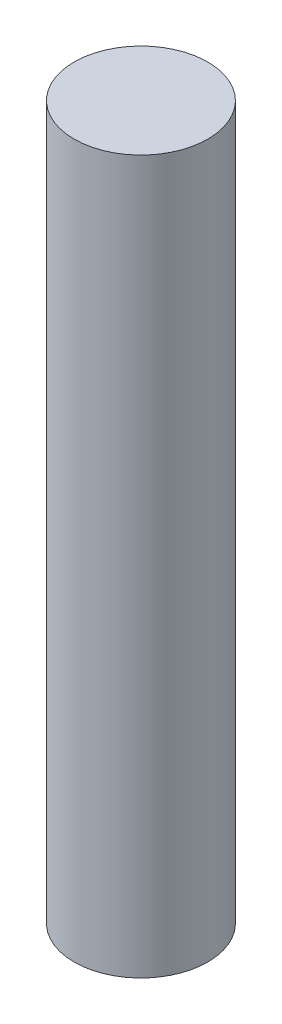
ISO-10303-21;
HEADER;
FILE_DESCRIPTION(('STEP AP214'),'2;1');
FILE_NAME('part.step','',(''),(''),'','','');
FILE_SCHEMA(('AUTOMOTIVE_DESIGN { 1 0 10303 214 1 1 1 1 }'));
ENDSEC;
DATA;
#1=APPLICATION_CONTEXT('core data for automotive mechanical design processes');
#2=APPLICATION_PROTOCOL_DEFINITION('international standard','automotive_design',2000,#1);
#3=PRODUCT_CONTEXT('',#1,'mechanical');
#4=PRODUCT('Part','Part','',(#3));
#5=PRODUCT_RELATED_PRODUCT_CATEGORY('part','',(#4));
#6=PRODUCT_DEFINITION_FORMATION('','',#4);
#7=PRODUCT_DEFINITION_CONTEXT('part definition',#1,'design');
#8=PRODUCT_DEFINITION('design','',#6,#7);
#9=PRODUCT_DEFINITION_SHAPE('','',#8);
#10=(LENGTH_UNIT() NAMED_UNIT(*) SI_UNIT(.MILLI.,.METRE.));
#11=(NAMED_UNIT(*) PLANE_ANGLE_UNIT() SI_UNIT($,.RADIAN.));
#12=(NAMED_UNIT(*) SI_UNIT($,.STERADIAN.) SOLID_ANGLE_UNIT());
#13=UNCERTAINTY_MEASURE_WITH_UNIT(LENGTH_MEASURE(1.E-05),#10,'distance_accuracy_value','');
#14=(GEOMETRIC_REPRESENTATION_CONTEXT(3) GLOBAL_UNCERTAINTY_ASSIGNED_CONTEXT((#13)) GLOBAL_UNIT_ASSIGNED_CONTEXT((#10,
#11,#12)) REPRESENTATION_CONTEXT('',''));
#15=CARTESIAN_POINT('',(0.,0.,0.));
#16=DIRECTION('',(0.,0.,1.));
#17=DIRECTION('',(1.,0.,0.));
#18=AXIS2_PLACEMENT_3D('',#15,#16,#17);
#19=CARTESIAN_POINT('',(0.,12.7,0.));
#20=DIRECTION('',(0.,-1.,0.));
#21=DIRECTION('',(0.,0.,-1.));
#22=AXIS2_PLACEMENT_3D('',#19,#20,#21);
#23=CYLINDRICAL_SURFACE('',#22,2.38125);
#24=CARTESIAN_POINT('',(0.,12.7,0.));
#25=DIRECTION('',(0.,1.,0.));
#26=DIRECTION('',(0.,0.,1.));
#27=AXIS2_PLACEMENT_3D('',#24,#25,#26);
#28=CIRCLE('',#27,2.38125);
#29=CARTESIAN_POINT('',(0.,12.7,2.38125));
#30=VERTEX_POINT('',#29);
#31=EDGE_CURVE('E10',#30,#30,#28,.T.);
#32=ORIENTED_EDGE('',*,*,#31,.F.);
#33=EDGE_LOOP('',(#32));
#34=FACE_BOUND('',#33,.T.);
#35=CARTESIAN_POINT('',(0.,-12.7,0.));
#36=DIRECTION('',(0.,1.,0.));
#37=DIRECTION('',(0.,0.,1.));
#38=AXIS2_PLACEMENT_3D('',#35,#36,#37);
#39=CIRCLE('',#38,2.38125);
#40=CARTESIAN_POINT('',(0.,-12.7,2.38125));
#41=VERTEX_POINT('',#40);
#42=EDGE_CURVE('E36',#41,#41,#39,.T.);
#43=ORIENTED_EDGE('',*,*,#42,.T.);
#44=EDGE_LOOP('',(#43));
#45=FACE_BOUND('',#44,.T.);
#46=ADVANCED_FACE('F33',(#34,#45),#23,.T.);
#47=CARTESIAN_POINT('',(0.,12.7,0.));
#48=DIRECTION('',(0.,1.,0.));
#49=DIRECTION('',(0.,0.,1.));
#50=AXIS2_PLACEMENT_3D('',#47,#48,#49);
#51=PLANE('',#50);
#52=ORIENTED_EDGE('',*,*,#31,.T.);
#53=EDGE_LOOP('',(#52));
#54=FACE_BOUND('',#53,.T.);
#55=ADVANCED_FACE('F48',(#54),#51,.T.);
#56=CARTESIAN_POINT('',(0.,-12.7,0.));
#57=DIRECTION('',(0.,1.,0.));
#58=DIRECTION('',(0.,0.,1.));
#59=AXIS2_PLACEMENT_3D('',#56,#57,#58);
#60=PLANE('',#59);
#61=ORIENTED_EDGE('',*,*,#42,.F.);
#62=EDGE_LOOP('',(#61));
#63=FACE_BOUND('',#62,.T.);
#64=ADVANCED_FACE('F46',(#63),#60,.F.);
#65=CLOSED_SHELL('',(#46,#55,#64));
#66=MANIFOLD_SOLID_BREP('B2',#65);
#67=ADVANCED_BREP_SHAPE_REPRESENTATION('',(#18,#66),#14);
#68=SHAPE_DEFINITION_REPRESENTATION(#9,#67);
ENDSEC;
END-ISO-10303-21;
